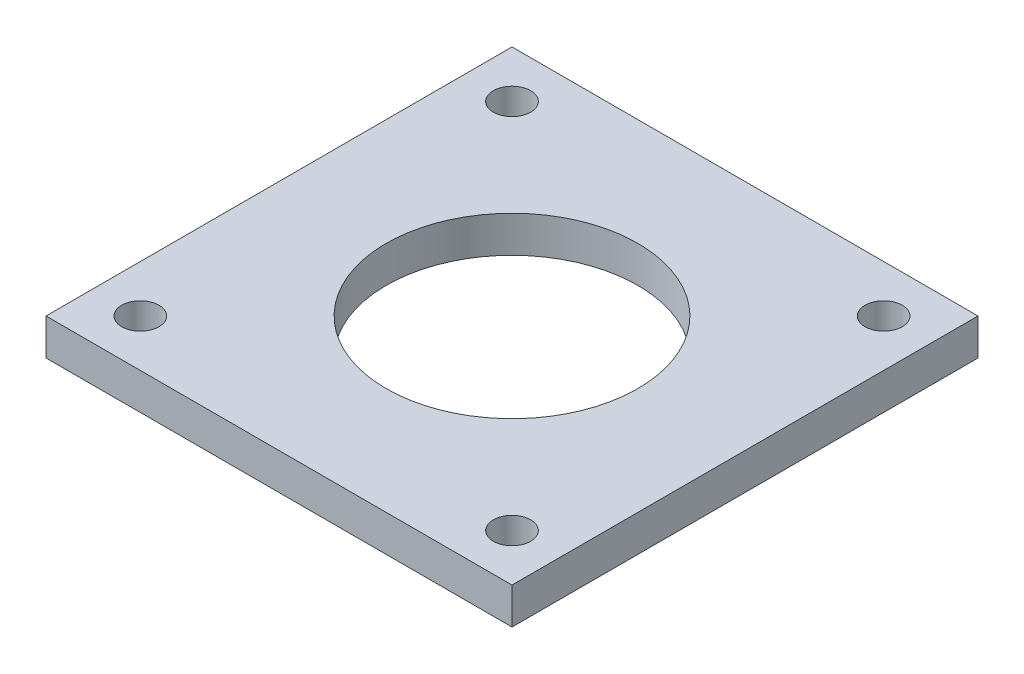
ISO-10303-21;
HEADER;
FILE_DESCRIPTION(('STEP AP214'),'2;1');
FILE_NAME('part.step','',(''),(''),'','','');
FILE_SCHEMA(('AUTOMOTIVE_DESIGN { 1 0 10303 214 1 1 1 1 }'));
ENDSEC;
DATA;
#1=APPLICATION_CONTEXT('core data for automotive mechanical design processes');
#2=APPLICATION_PROTOCOL_DEFINITION('international standard','automotive_design',2000,#1);
#3=PRODUCT_CONTEXT('',#1,'mechanical');
#4=PRODUCT('Part','Part','',(#3));
#5=PRODUCT_RELATED_PRODUCT_CATEGORY('part','',(#4));
#6=PRODUCT_DEFINITION_FORMATION('','',#4);
#7=PRODUCT_DEFINITION_CONTEXT('part definition',#1,'design');
#8=PRODUCT_DEFINITION('design','',#6,#7);
#9=PRODUCT_DEFINITION_SHAPE('','',#8);
#10=(LENGTH_UNIT() NAMED_UNIT(*) SI_UNIT(.MILLI.,.METRE.));
#11=(NAMED_UNIT(*) PLANE_ANGLE_UNIT() SI_UNIT($,.RADIAN.));
#12=(NAMED_UNIT(*) SI_UNIT($,.STERADIAN.) SOLID_ANGLE_UNIT());
#13=UNCERTAINTY_MEASURE_WITH_UNIT(LENGTH_MEASURE(1.E-05),#10,'distance_accuracy_value','');
#14=(GEOMETRIC_REPRESENTATION_CONTEXT(3) GLOBAL_UNCERTAINTY_ASSIGNED_CONTEXT((#13)) GLOBAL_UNIT_ASSIGNED_CONTEXT((#10,
#11,#12)) REPRESENTATION_CONTEXT('',''));
#15=CARTESIAN_POINT('',(0.,0.,0.));
#16=DIRECTION('',(0.,0.,1.));
#17=DIRECTION('',(1.,0.,0.));
#18=AXIS2_PLACEMENT_3D('',#15,#16,#17);
#19=CARTESIAN_POINT('',(0.,7.9375,0.));
#20=DIRECTION('',(0.,-1.,0.));
#21=DIRECTION('',(0.,0.,-1.));
#22=AXIS2_PLACEMENT_3D('',#19,#20,#21);
#23=PLANE('',#22);
#24=DIRECTION('',(0.,0.,-1.));
#25=VECTOR('',#24,1.);
#26=CARTESIAN_POINT('',(50.8,7.9375,50.8));
#27=LINE('',#26,#25);
#28=CARTESIAN_POINT('',(50.8,7.9375,50.8));
#29=VERTEX_POINT('',#28);
#30=CARTESIAN_POINT('',(50.8,7.9375,-50.8));
#31=VERTEX_POINT('',#30);
#32=EDGE_CURVE('E85',#29,#31,#27,.T.);
#33=ORIENTED_EDGE('',*,*,#32,.T.);
#34=DIRECTION('',(-1.,0.,0.));
#35=VECTOR('',#34,1.);
#36=CARTESIAN_POINT('',(-50.8,7.9375,-50.8));
#37=LINE('',#36,#35);
#38=CARTESIAN_POINT('',(-50.8,7.9375,-50.8));
#39=VERTEX_POINT('',#38);
#40=EDGE_CURVE('E80',#31,#39,#37,.T.);
#41=ORIENTED_EDGE('',*,*,#40,.T.);
#42=DIRECTION('',(0.,0.,1.));
#43=VECTOR('',#42,1.);
#44=CARTESIAN_POINT('',(-50.8,7.9375,50.8));
#45=LINE('',#44,#43);
#46=CARTESIAN_POINT('',(-50.8,7.9375,50.8));
#47=VERTEX_POINT('',#46);
#48=EDGE_CURVE('E83',#39,#47,#45,.T.);
#49=ORIENTED_EDGE('',*,*,#48,.T.);
#50=DIRECTION('',(1.,0.,0.));
#51=VECTOR('',#50,1.);
#52=CARTESIAN_POINT('',(-50.8,7.9375,50.8));
#53=LINE('',#52,#51);
#54=EDGE_CURVE('E50',#47,#29,#53,.T.);
#55=ORIENTED_EDGE('',*,*,#54,.T.);
#56=EDGE_LOOP('',(#33,#41,#49,#55));
#57=FACE_BOUND('',#56,.T.);
#58=CARTESIAN_POINT('',(0.,7.9375,0.));
#59=DIRECTION('',(0.,1.,0.));
#60=DIRECTION('',(0.,0.,1.));
#61=AXIS2_PLACEMENT_3D('',#58,#59,#60);
#62=CIRCLE('',#61,27.432);
#63=CARTESIAN_POINT('',(0.,7.9375,27.432));
#64=VERTEX_POINT('',#63);
#65=EDGE_CURVE('E100',#64,#64,#62,.T.);
#66=ORIENTED_EDGE('',*,*,#65,.F.);
#67=EDGE_LOOP('',(#66));
#68=FACE_BOUND('',#67,.T.);
#69=CARTESIAN_POINT('',(-40.513,7.9375,-40.513));
#70=DIRECTION('',(0.,1.,0.));
#71=DIRECTION('',(0.,0.,1.));
#72=AXIS2_PLACEMENT_3D('',#69,#70,#71);
#73=CIRCLE('',#72,4.064);
#74=CARTESIAN_POINT('',(-40.513,7.9375,-36.449));
#75=VERTEX_POINT('',#74);
#76=EDGE_CURVE('E115',#75,#75,#73,.T.);
#77=ORIENTED_EDGE('',*,*,#76,.F.);
#78=EDGE_LOOP('',(#77));
#79=FACE_BOUND('',#78,.T.);
#80=CARTESIAN_POINT('',(40.513,7.9375,-40.513));
#81=DIRECTION('',(0.,1.,0.));
#82=DIRECTION('',(0.,0.,1.));
#83=AXIS2_PLACEMENT_3D('',#80,#81,#82);
#84=CIRCLE('',#83,4.06400000000001);
#85=CARTESIAN_POINT('',(40.513,7.9375,-36.449));
#86=VERTEX_POINT('',#85);
#87=EDGE_CURVE('E121',#86,#86,#84,.T.);
#88=ORIENTED_EDGE('',*,*,#87,.F.);
#89=EDGE_LOOP('',(#88));
#90=FACE_BOUND('',#89,.T.);
#91=CARTESIAN_POINT('',(-40.513,7.9375,40.513));
#92=DIRECTION('',(0.,1.,0.));
#93=DIRECTION('',(0.,0.,1.));
#94=AXIS2_PLACEMENT_3D('',#91,#92,#93);
#95=CIRCLE('',#94,4.06400000000001);
#96=CARTESIAN_POINT('',(-40.513,7.9375,44.577));
#97=VERTEX_POINT('',#96);
#98=EDGE_CURVE('E127',#97,#97,#95,.T.);
#99=ORIENTED_EDGE('',*,*,#98,.F.);
#100=EDGE_LOOP('',(#99));
#101=FACE_BOUND('',#100,.T.);
#102=CARTESIAN_POINT('',(40.513,7.9375,40.513));
#103=DIRECTION('',(0.,1.,0.));
#104=DIRECTION('',(0.,0.,1.));
#105=AXIS2_PLACEMENT_3D('',#102,#103,#104);
#106=CIRCLE('',#105,4.06400000000001);
#107=CARTESIAN_POINT('',(40.513,7.9375,44.577));
#108=VERTEX_POINT('',#107);
#109=EDGE_CURVE('E133',#108,#108,#106,.T.);
#110=ORIENTED_EDGE('',*,*,#109,.F.);
#111=EDGE_LOOP('',(#110));
#112=FACE_BOUND('',#111,.T.);
#113=ADVANCED_FACE('F33',(#57,#68,#79,#90,#101,#112),#23,.F.);
#114=CARTESIAN_POINT('',(0.,0.,0.));
#115=DIRECTION('',(0.,-1.,0.));
#116=DIRECTION('',(0.,0.,-1.));
#117=AXIS2_PLACEMENT_3D('',#114,#115,#116);
#118=PLANE('',#117);
#119=CARTESIAN_POINT('',(-40.513,0.,40.513));
#120=DIRECTION('',(0.,1.,0.));
#121=DIRECTION('',(0.,0.,1.));
#122=AXIS2_PLACEMENT_3D('',#119,#120,#121);
#123=CIRCLE('',#122,4.06400000000001);
#124=CARTESIAN_POINT('',(-40.513,0.,44.577));
#125=VERTEX_POINT('',#124);
#126=EDGE_CURVE('E130',#125,#125,#123,.T.);
#127=ORIENTED_EDGE('',*,*,#126,.T.);
#128=EDGE_LOOP('',(#127));
#129=FACE_BOUND('',#128,.T.);
#130=CARTESIAN_POINT('',(-40.513,0.,-40.513));
#131=DIRECTION('',(0.,1.,0.));
#132=DIRECTION('',(0.,0.,1.));
#133=AXIS2_PLACEMENT_3D('',#130,#131,#132);
#134=CIRCLE('',#133,4.064);
#135=CARTESIAN_POINT('',(-40.513,0.,-36.449));
#136=VERTEX_POINT('',#135);
#137=EDGE_CURVE('E118',#136,#136,#134,.T.);
#138=ORIENTED_EDGE('',*,*,#137,.T.);
#139=EDGE_LOOP('',(#138));
#140=FACE_BOUND('',#139,.T.);
#141=DIRECTION('',(0.,0.,-1.));
#142=VECTOR('',#141,1.);
#143=CARTESIAN_POINT('',(50.8,0.,50.8));
#144=LINE('',#143,#142);
#145=CARTESIAN_POINT('',(50.8,0.,50.8));
#146=VERTEX_POINT('',#145);
#147=CARTESIAN_POINT('',(50.8,0.,-50.8));
#148=VERTEX_POINT('',#147);
#149=EDGE_CURVE('E97',#146,#148,#144,.T.);
#150=ORIENTED_EDGE('',*,*,#149,.F.);
#151=DIRECTION('',(1.,0.,0.));
#152=VECTOR('',#151,1.);
#153=CARTESIAN_POINT('',(-50.8,0.,50.8));
#154=LINE('',#153,#152);
#155=CARTESIAN_POINT('',(-50.8,0.,50.8));
#156=VERTEX_POINT('',#155);
#157=EDGE_CURVE('E73',#156,#146,#154,.T.);
#158=ORIENTED_EDGE('',*,*,#157,.F.);
#159=DIRECTION('',(0.,0.,1.));
#160=VECTOR('',#159,1.);
#161=CARTESIAN_POINT('',(-50.8,0.,50.8));
#162=LINE('',#161,#160);
#163=CARTESIAN_POINT('',(-50.8,0.,-50.8));
#164=VERTEX_POINT('',#163);
#165=EDGE_CURVE('E67',#164,#156,#162,.T.);
#166=ORIENTED_EDGE('',*,*,#165,.F.);
#167=DIRECTION('',(-1.,0.,0.));
#168=VECTOR('',#167,1.);
#169=CARTESIAN_POINT('',(-50.8,0.,-50.8));
#170=LINE('',#169,#168);
#171=EDGE_CURVE('E89',#148,#164,#170,.T.);
#172=ORIENTED_EDGE('',*,*,#171,.F.);
#173=EDGE_LOOP('',(#150,#158,#166,#172));
#174=FACE_BOUND('',#173,.T.);
#175=CARTESIAN_POINT('',(0.,0.,0.));
#176=DIRECTION('',(0.,1.,0.));
#177=DIRECTION('',(0.,0.,1.));
#178=AXIS2_PLACEMENT_3D('',#175,#176,#177);
#179=CIRCLE('',#178,27.432);
#180=CARTESIAN_POINT('',(0.,0.,27.432));
#181=VERTEX_POINT('',#180);
#182=EDGE_CURVE('E112',#181,#181,#179,.T.);
#183=ORIENTED_EDGE('',*,*,#182,.T.);
#184=EDGE_LOOP('',(#183));
#185=FACE_BOUND('',#184,.T.);
#186=CARTESIAN_POINT('',(40.513,0.,-40.513));
#187=DIRECTION('',(0.,1.,0.));
#188=DIRECTION('',(0.,0.,1.));
#189=AXIS2_PLACEMENT_3D('',#186,#187,#188);
#190=CIRCLE('',#189,4.06400000000001);
#191=CARTESIAN_POINT('',(40.513,0.,-36.449));
#192=VERTEX_POINT('',#191);
#193=EDGE_CURVE('E124',#192,#192,#190,.T.);
#194=ORIENTED_EDGE('',*,*,#193,.T.);
#195=EDGE_LOOP('',(#194));
#196=FACE_BOUND('',#195,.T.);
#197=CARTESIAN_POINT('',(40.513,0.,40.513));
#198=DIRECTION('',(0.,1.,0.));
#199=DIRECTION('',(0.,0.,1.));
#200=AXIS2_PLACEMENT_3D('',#197,#198,#199);
#201=CIRCLE('',#200,4.06400000000001);
#202=CARTESIAN_POINT('',(40.513,0.,44.577));
#203=VERTEX_POINT('',#202);
#204=EDGE_CURVE('E136',#203,#203,#201,.T.);
#205=ORIENTED_EDGE('',*,*,#204,.T.);
#206=EDGE_LOOP('',(#205));
#207=FACE_BOUND('',#206,.T.);
#208=ADVANCED_FACE('F108',(#129,#140,#174,#185,#196,#207),#118,.T.);
#209=CARTESIAN_POINT('',(50.8,7.9375,50.8));
#210=DIRECTION('',(-1.,0.,0.));
#211=DIRECTION('',(0.,0.,1.));
#212=AXIS2_PLACEMENT_3D('',#209,#210,#211);
#213=PLANE('',#212);
#214=ORIENTED_EDGE('',*,*,#149,.T.);
#215=DIRECTION('',(0.,-1.,0.));
#216=VECTOR('',#215,1.);
#217=CARTESIAN_POINT('',(50.8,7.9375,-50.8));
#218=LINE('',#217,#216);
#219=EDGE_CURVE('E11',#31,#148,#218,.T.);
#220=ORIENTED_EDGE('',*,*,#219,.F.);
#221=ORIENTED_EDGE('',*,*,#32,.F.);
#222=DIRECTION('',(0.,-1.,0.));
#223=VECTOR('',#222,1.);
#224=CARTESIAN_POINT('',(50.8,7.9375,50.8));
#225=LINE('',#224,#223);
#226=EDGE_CURVE('E93',#29,#146,#225,.T.);
#227=ORIENTED_EDGE('',*,*,#226,.T.);
#228=EDGE_LOOP('',(#214,#220,#221,#227));
#229=FACE_BOUND('',#228,.T.);
#230=ADVANCED_FACE('F35',(#229),#213,.F.);
#231=CARTESIAN_POINT('',(-50.8,7.9375,-50.8));
#232=DIRECTION('',(0.,0.,1.));
#233=DIRECTION('',(1.,0.,0.));
#234=AXIS2_PLACEMENT_3D('',#231,#232,#233);
#235=PLANE('',#234);
#236=ORIENTED_EDGE('',*,*,#171,.T.);
#237=DIRECTION('',(0.,-1.,0.));
#238=VECTOR('',#237,1.);
#239=CARTESIAN_POINT('',(-50.8,7.9375,-50.8));
#240=LINE('',#239,#238);
#241=EDGE_CURVE('E42',#39,#164,#240,.T.);
#242=ORIENTED_EDGE('',*,*,#241,.F.);
#243=ORIENTED_EDGE('',*,*,#40,.F.);
#244=ORIENTED_EDGE('',*,*,#219,.T.);
#245=EDGE_LOOP('',(#236,#242,#243,#244));
#246=FACE_BOUND('',#245,.T.);
#247=ADVANCED_FACE('F88',(#246),#235,.F.);
#248=CARTESIAN_POINT('',(-50.8,7.9375,50.8));
#249=DIRECTION('',(1.,0.,0.));
#250=DIRECTION('',(0.,0.,-1.));
#251=AXIS2_PLACEMENT_3D('',#248,#249,#250);
#252=PLANE('',#251);
#253=ORIENTED_EDGE('',*,*,#165,.T.);
#254=DIRECTION('',(0.,-1.,0.));
#255=VECTOR('',#254,1.);
#256=CARTESIAN_POINT('',(-50.8,7.9375,50.8));
#257=LINE('',#256,#255);
#258=EDGE_CURVE('E90',#47,#156,#257,.T.);
#259=ORIENTED_EDGE('',*,*,#258,.F.);
#260=ORIENTED_EDGE('',*,*,#48,.F.);
#261=ORIENTED_EDGE('',*,*,#241,.T.);
#262=EDGE_LOOP('',(#253,#259,#260,#261));
#263=FACE_BOUND('',#262,.T.);
#264=ADVANCED_FACE('F91',(#263),#252,.F.);
#265=CARTESIAN_POINT('',(-50.8,7.9375,50.8));
#266=DIRECTION('',(0.,0.,-1.));
#267=DIRECTION('',(-1.,0.,0.));
#268=AXIS2_PLACEMENT_3D('',#265,#266,#267);
#269=PLANE('',#268);
#270=ORIENTED_EDGE('',*,*,#157,.T.);
#271=ORIENTED_EDGE('',*,*,#226,.F.);
#272=ORIENTED_EDGE('',*,*,#54,.F.);
#273=ORIENTED_EDGE('',*,*,#258,.T.);
#274=EDGE_LOOP('',(#270,#271,#272,#273));
#275=FACE_BOUND('',#274,.T.);
#276=ADVANCED_FACE('F105',(#275),#269,.F.);
#277=CARTESIAN_POINT('',(0.,7.9375,0.));
#278=DIRECTION('',(0.,-1.,0.));
#279=DIRECTION('',(0.,0.,-1.));
#280=AXIS2_PLACEMENT_3D('',#277,#278,#279);
#281=CYLINDRICAL_SURFACE('',#280,27.432);
#282=ORIENTED_EDGE('',*,*,#65,.T.);
#283=EDGE_LOOP('',(#282));
#284=FACE_BOUND('',#283,.T.);
#285=ORIENTED_EDGE('',*,*,#182,.F.);
#286=EDGE_LOOP('',(#285));
#287=FACE_BOUND('',#286,.T.);
#288=ADVANCED_FACE('F153',(#284,#287),#281,.F.);
#289=CARTESIAN_POINT('',(-40.513,7.9375,-40.513));
#290=DIRECTION('',(0.,-1.,0.));
#291=DIRECTION('',(0.,0.,-1.));
#292=AXIS2_PLACEMENT_3D('',#289,#290,#291);
#293=CYLINDRICAL_SURFACE('',#292,4.064);
#294=ORIENTED_EDGE('',*,*,#76,.T.);
#295=EDGE_LOOP('',(#294));
#296=FACE_BOUND('',#295,.T.);
#297=ORIENTED_EDGE('',*,*,#137,.F.);
#298=EDGE_LOOP('',(#297));
#299=FACE_BOUND('',#298,.T.);
#300=ADVANCED_FACE('F199',(#296,#299),#293,.F.);
#301=CARTESIAN_POINT('',(40.513,7.9375,-40.513));
#302=DIRECTION('',(0.,-1.,0.));
#303=DIRECTION('',(0.,0.,-1.));
#304=AXIS2_PLACEMENT_3D('',#301,#302,#303);
#305=CYLINDRICAL_SURFACE('',#304,4.06400000000001);
#306=ORIENTED_EDGE('',*,*,#87,.T.);
#307=EDGE_LOOP('',(#306));
#308=FACE_BOUND('',#307,.T.);
#309=ORIENTED_EDGE('',*,*,#193,.F.);
#310=EDGE_LOOP('',(#309));
#311=FACE_BOUND('',#310,.T.);
#312=ADVANCED_FACE('F207',(#308,#311),#305,.F.);
#313=CARTESIAN_POINT('',(-40.513,7.9375,40.513));
#314=DIRECTION('',(0.,-1.,0.));
#315=DIRECTION('',(0.,0.,-1.));
#316=AXIS2_PLACEMENT_3D('',#313,#314,#315);
#317=CYLINDRICAL_SURFACE('',#316,4.06400000000001);
#318=ORIENTED_EDGE('',*,*,#98,.T.);
#319=EDGE_LOOP('',(#318));
#320=FACE_BOUND('',#319,.T.);
#321=ORIENTED_EDGE('',*,*,#126,.F.);
#322=EDGE_LOOP('',(#321));
#323=FACE_BOUND('',#322,.T.);
#324=ADVANCED_FACE('F215',(#320,#323),#317,.F.);
#325=CARTESIAN_POINT('',(40.513,7.9375,40.513));
#326=DIRECTION('',(0.,-1.,0.));
#327=DIRECTION('',(0.,0.,-1.));
#328=AXIS2_PLACEMENT_3D('',#325,#326,#327);
#329=CYLINDRICAL_SURFACE('',#328,4.06400000000001);
#330=ORIENTED_EDGE('',*,*,#109,.T.);
#331=EDGE_LOOP('',(#330));
#332=FACE_BOUND('',#331,.T.);
#333=ORIENTED_EDGE('',*,*,#204,.F.);
#334=EDGE_LOOP('',(#333));
#335=FACE_BOUND('',#334,.T.);
#336=ADVANCED_FACE('F142',(#332,#335),#329,.F.);
#337=CLOSED_SHELL('',(#113,#208,#230,#247,#264,#276,#288,#300,#312,#324,#336));
#338=MANIFOLD_SOLID_BREP('B2',#337);
#339=ADVANCED_BREP_SHAPE_REPRESENTATION('',(#18,#338),#14);
#340=SHAPE_DEFINITION_REPRESENTATION(#9,#339);
ENDSEC;
END-ISO-10303-21;
